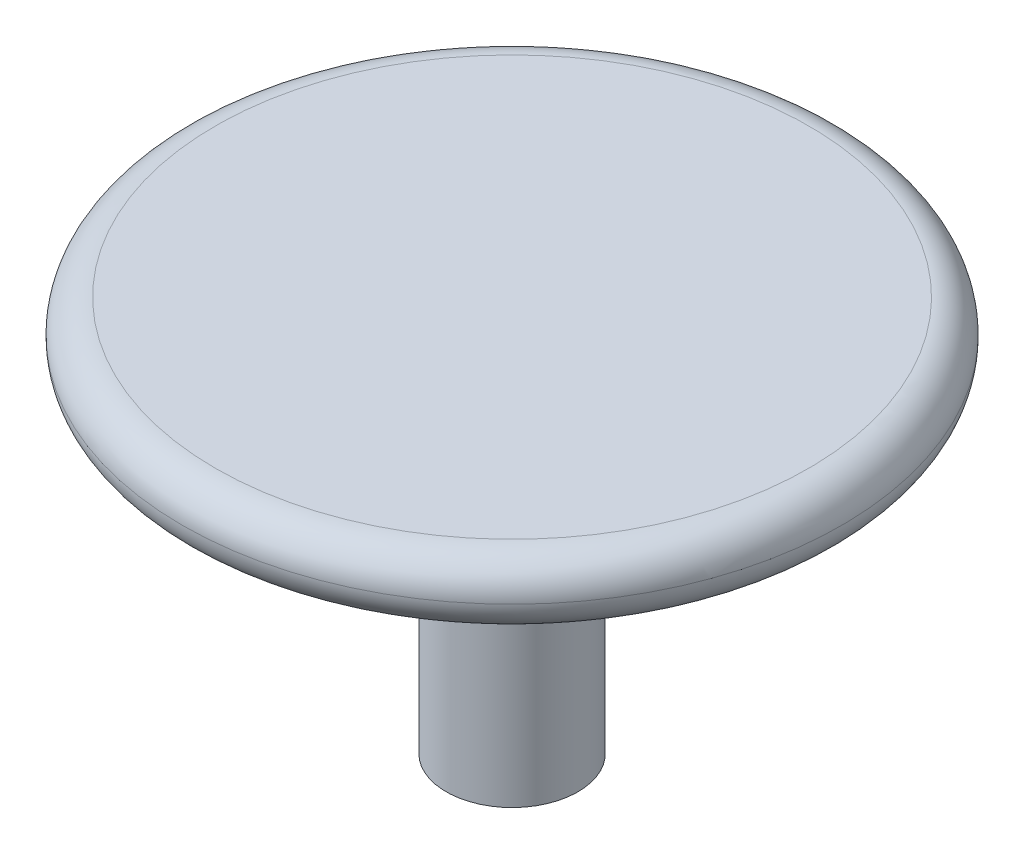
ISO-10303-21;
HEADER;
FILE_DESCRIPTION(('STEP AP214'),'2;1');
FILE_NAME('part.step','',(''),(''),'','','');
FILE_SCHEMA(('AUTOMOTIVE_DESIGN { 1 0 10303 214 1 1 1 1 }'));
ENDSEC;
DATA;
#1=APPLICATION_CONTEXT('core data for automotive mechanical design processes');
#2=APPLICATION_PROTOCOL_DEFINITION('international standard','automotive_design',2000,#1);
#3=PRODUCT_CONTEXT('',#1,'mechanical');
#4=PRODUCT('Part','Part','',(#3));
#5=PRODUCT_RELATED_PRODUCT_CATEGORY('part','',(#4));
#6=PRODUCT_DEFINITION_FORMATION('','',#4);
#7=PRODUCT_DEFINITION_CONTEXT('part definition',#1,'design');
#8=PRODUCT_DEFINITION('design','',#6,#7);
#9=PRODUCT_DEFINITION_SHAPE('','',#8);
#10=(LENGTH_UNIT() NAMED_UNIT(*) SI_UNIT(.MILLI.,.METRE.));
#11=(NAMED_UNIT(*) PLANE_ANGLE_UNIT() SI_UNIT($,.RADIAN.));
#12=(NAMED_UNIT(*) SI_UNIT($,.STERADIAN.) SOLID_ANGLE_UNIT());
#13=UNCERTAINTY_MEASURE_WITH_UNIT(LENGTH_MEASURE(1.E-05),#10,'distance_accuracy_value','');
#14=(GEOMETRIC_REPRESENTATION_CONTEXT(3) GLOBAL_UNCERTAINTY_ASSIGNED_CONTEXT((#13)) GLOBAL_UNIT_ASSIGNED_CONTEXT((#10,
#11,#12)) REPRESENTATION_CONTEXT('',''));
#15=CARTESIAN_POINT('',(0.,0.,0.));
#16=DIRECTION('',(0.,0.,1.));
#17=DIRECTION('',(1.,0.,0.));
#18=AXIS2_PLACEMENT_3D('',#15,#16,#17);
#19=CARTESIAN_POINT('',(0.,0.499999999999973,0.));
#20=DIRECTION('',(0.,1.,0.));
#21=DIRECTION('',(0.,0.,1.));
#22=AXIS2_PLACEMENT_3D('',#19,#20,#21);
#23=PLANE('',#22);
#24=CARTESIAN_POINT('',(0.,0.499999999999973,0.));
#25=DIRECTION('',(0.,1.,0.));
#26=DIRECTION('',(0.,0.,1.));
#27=AXIS2_PLACEMENT_3D('',#24,#25,#26);
#28=CIRCLE('',#27,2.25);
#29=CARTESIAN_POINT('',(0.,0.499999999999973,2.25000000000003));
#30=VERTEX_POINT('',#29);
#31=EDGE_CURVE('E44',#30,#30,#28,.T.);
#32=ORIENTED_EDGE('',*,*,#31,.T.);
#33=EDGE_LOOP('',(#32));
#34=FACE_BOUND('',#33,.T.);
#35=ADVANCED_FACE('F36',(#34),#23,.T.);
#36=CARTESIAN_POINT('',(0.,0.,0.));
#37=DIRECTION('',(0.,1.,0.));
#38=DIRECTION('',(0.,0.,1.));
#39=AXIS2_PLACEMENT_3D('',#36,#37,#38);
#40=PLANE('',#39);
#41=CARTESIAN_POINT('',(0.,0.,0.));
#42=DIRECTION('',(0.,1.,0.));
#43=DIRECTION('',(0.,0.,1.));
#44=AXIS2_PLACEMENT_3D('',#41,#42,#43);
#45=CIRCLE('',#44,2.25);
#46=CARTESIAN_POINT('',(0.,0.,2.25));
#47=VERTEX_POINT('',#46);
#48=EDGE_CURVE('E10',#47,#47,#45,.F.);
#49=ORIENTED_EDGE('',*,*,#48,.T.);
#50=EDGE_LOOP('',(#49));
#51=FACE_BOUND('',#50,.T.);
#52=CARTESIAN_POINT('',(0.,0.,0.));
#53=DIRECTION('',(0.,-1.,0.));
#54=DIRECTION('',(0.,0.,-1.));
#55=AXIS2_PLACEMENT_3D('',#52,#53,#54);
#56=CIRCLE('',#55,0.5);
#57=CARTESIAN_POINT('',(0.,0.,-0.5));
#58=VERTEX_POINT('',#57);
#59=EDGE_CURVE('E48',#58,#58,#56,.T.);
#60=ORIENTED_EDGE('',*,*,#59,.F.);
#61=EDGE_LOOP('',(#60));
#62=FACE_BOUND('',#61,.T.);
#63=ADVANCED_FACE('F73',(#51,#62),#40,.F.);
#64=CARTESIAN_POINT('',(0.,-2.5,0.));
#65=DIRECTION('',(0.,1.,0.));
#66=DIRECTION('',(0.,0.,1.));
#67=AXIS2_PLACEMENT_3D('',#64,#65,#66);
#68=CYLINDRICAL_SURFACE('',#67,0.5);
#69=CARTESIAN_POINT('',(0.,-2.5,0.));
#70=DIRECTION('',(0.,-1.,0.));
#71=DIRECTION('',(0.,0.,-1.));
#72=AXIS2_PLACEMENT_3D('',#69,#70,#71);
#73=CIRCLE('',#72,0.5);
#74=CARTESIAN_POINT('',(0.,-2.5,-0.499999999999958));
#75=VERTEX_POINT('',#74);
#76=EDGE_CURVE('E53',#75,#75,#73,.T.);
#77=ORIENTED_EDGE('',*,*,#76,.F.);
#78=EDGE_LOOP('',(#77));
#79=FACE_BOUND('',#78,.T.);
#80=ORIENTED_EDGE('',*,*,#59,.T.);
#81=EDGE_LOOP('',(#80));
#82=FACE_BOUND('',#81,.T.);
#83=ADVANCED_FACE('F70',(#79,#82),#68,.T.);
#84=CARTESIAN_POINT('',(0.,-2.5,0.));
#85=DIRECTION('',(0.,-1.,0.));
#86=DIRECTION('',(0.,0.,-1.));
#87=AXIS2_PLACEMENT_3D('',#84,#85,#86);
#88=PLANE('',#87);
#89=ORIENTED_EDGE('',*,*,#76,.T.);
#90=EDGE_LOOP('',(#89));
#91=FACE_BOUND('',#90,.T.);
#92=ADVANCED_FACE('F64',(#91),#88,.T.);
#93=CARTESIAN_POINT('',(0.,0.250000000000028,0.));
#94=DIRECTION('',(0.,1.,0.));
#95=DIRECTION('',(0.,0.,1.));
#96=AXIS2_PLACEMENT_3D('',#93,#94,#95);
#97=TOROIDAL_SURFACE('',#96,2.25,0.25);
#98=ORIENTED_EDGE('',*,*,#48,.F.);
#99=EDGE_LOOP('',(#98));
#100=FACE_BOUND('',#99,.T.);
#101=CARTESIAN_POINT('',(0.,0.250000000000028,0.));
#102=DIRECTION('',(0.,1.,0.));
#103=DIRECTION('',(0.,0.,1.));
#104=AXIS2_PLACEMENT_3D('',#101,#102,#103);
#105=CIRCLE('',#104,2.5);
#106=CARTESIAN_POINT('',(0.,0.250000000000028,2.50000000000003));
#107=VERTEX_POINT('',#106);
#108=EDGE_CURVE('E40',#107,#107,#105,.T.);
#109=ORIENTED_EDGE('',*,*,#108,.F.);
#110=EDGE_LOOP('',(#109));
#111=FACE_BOUND('',#110,.T.);
#112=ADVANCED_FACE('F38',(#100,#111),#97,.T.);
#113=CARTESIAN_POINT('',(0.,0.250000000000028,0.));
#114=DIRECTION('',(0.,1.,0.));
#115=DIRECTION('',(0.,0.,1.));
#116=AXIS2_PLACEMENT_3D('',#113,#114,#115);
#117=TOROIDAL_SURFACE('',#116,2.25,0.25);
#118=ORIENTED_EDGE('',*,*,#108,.T.);
#119=EDGE_LOOP('',(#118));
#120=FACE_BOUND('',#119,.T.);
#121=ORIENTED_EDGE('',*,*,#31,.F.);
#122=EDGE_LOOP('',(#121));
#123=FACE_BOUND('',#122,.T.);
#124=ADVANCED_FACE('F60',(#120,#123),#117,.T.);
#125=CLOSED_SHELL('',(#35,#63,#83,#92,#112,#124));
#126=MANIFOLD_SOLID_BREP('B2',#125);
#127=ADVANCED_BREP_SHAPE_REPRESENTATION('',(#18,#126),#14);
#128=SHAPE_DEFINITION_REPRESENTATION(#9,#127);
ENDSEC;
END-ISO-10303-21;
